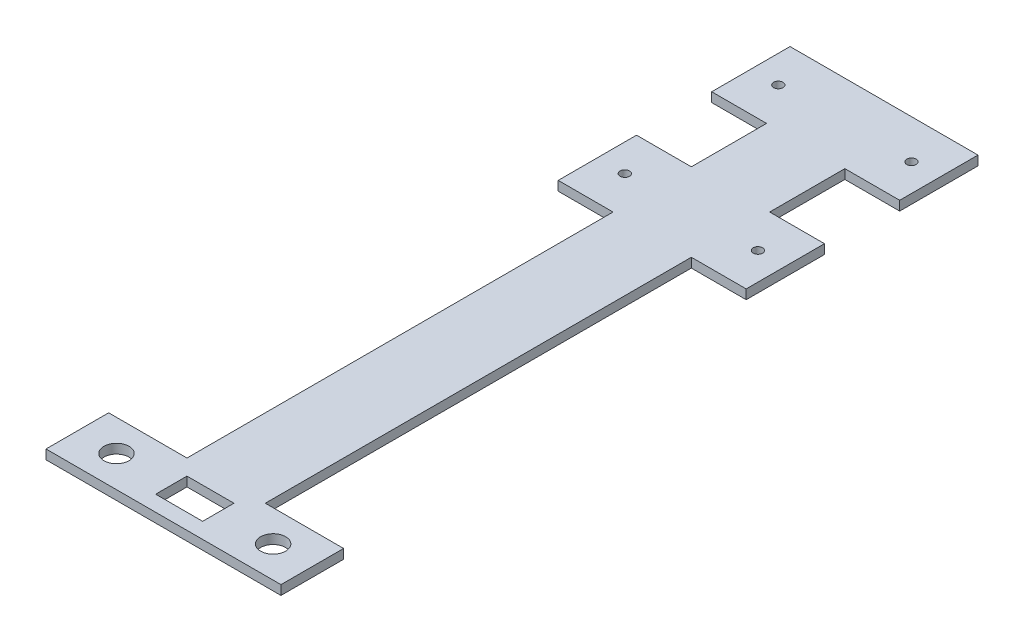
ISO-10303-21;
HEADER;
FILE_DESCRIPTION(('STEP AP214'),'2;1');
FILE_NAME('part.step','',(''),(''),'','','');
FILE_SCHEMA(('AUTOMOTIVE_DESIGN { 1 0 10303 214 1 1 1 1 }'));
ENDSEC;
DATA;
#1=APPLICATION_CONTEXT('core data for automotive mechanical design processes');
#2=APPLICATION_PROTOCOL_DEFINITION('international standard','automotive_design',2000,#1);
#3=PRODUCT_CONTEXT('',#1,'mechanical');
#4=PRODUCT('Part','Part','',(#3));
#5=PRODUCT_RELATED_PRODUCT_CATEGORY('part','',(#4));
#6=PRODUCT_DEFINITION_FORMATION('','',#4);
#7=PRODUCT_DEFINITION_CONTEXT('part definition',#1,'design');
#8=PRODUCT_DEFINITION('design','',#6,#7);
#9=PRODUCT_DEFINITION_SHAPE('','',#8);
#10=(LENGTH_UNIT() NAMED_UNIT(*) SI_UNIT(.MILLI.,.METRE.));
#11=(NAMED_UNIT(*) PLANE_ANGLE_UNIT() SI_UNIT($,.RADIAN.));
#12=(NAMED_UNIT(*) SI_UNIT($,.STERADIAN.) SOLID_ANGLE_UNIT());
#13=UNCERTAINTY_MEASURE_WITH_UNIT(LENGTH_MEASURE(1.E-05),#10,'distance_accuracy_value','');
#14=(GEOMETRIC_REPRESENTATION_CONTEXT(3) GLOBAL_UNCERTAINTY_ASSIGNED_CONTEXT((#13)) GLOBAL_UNIT_ASSIGNED_CONTEXT((#10,
#11,#12)) REPRESENTATION_CONTEXT('',''));
#15=CARTESIAN_POINT('',(0.,0.,0.));
#16=DIRECTION('',(0.,0.,1.));
#17=DIRECTION('',(1.,0.,0.));
#18=AXIS2_PLACEMENT_3D('',#15,#16,#17);
#19=CARTESIAN_POINT('',(0.,3.,-41.));
#20=DIRECTION('',(0.,0.,1.));
#21=DIRECTION('',(1.,0.,0.));
#22=AXIS2_PLACEMENT_3D('',#19,#20,#21);
#23=PLANE('',#22);
#24=DIRECTION('',(-1.,0.,0.));
#25=VECTOR('',#24,1.);
#26=CARTESIAN_POINT('',(0.,0.,-41.));
#27=LINE('',#26,#25);
#28=CARTESIAN_POINT('',(30.,0.,-41.));
#29=VERTEX_POINT('',#28);
#30=CARTESIAN_POINT('',(12.5,0.,-41.));
#31=VERTEX_POINT('',#30);
#32=EDGE_CURVE('E295',#29,#31,#27,.T.);
#33=ORIENTED_EDGE('',*,*,#32,.F.);
#34=DIRECTION('',(0.,-1.,0.));
#35=VECTOR('',#34,1.);
#36=CARTESIAN_POINT('',(30.,3.,-41.));
#37=LINE('',#36,#35);
#38=CARTESIAN_POINT('',(30.,3.,-41.));
#39=VERTEX_POINT('',#38);
#40=EDGE_CURVE('E11',#39,#29,#37,.T.);
#41=ORIENTED_EDGE('',*,*,#40,.F.);
#42=DIRECTION('',(-1.,0.,0.));
#43=VECTOR('',#42,1.);
#44=CARTESIAN_POINT('',(0.,3.,-41.));
#45=LINE('',#44,#43);
#46=CARTESIAN_POINT('',(12.5,3.,-41.));
#47=VERTEX_POINT('',#46);
#48=EDGE_CURVE('E296',#39,#47,#45,.T.);
#49=ORIENTED_EDGE('',*,*,#48,.T.);
#50=DIRECTION('',(0.,-1.,0.));
#51=VECTOR('',#50,1.);
#52=CARTESIAN_POINT('',(12.5,3.,-41.));
#53=LINE('',#52,#51);
#54=EDGE_CURVE('E427',#47,#31,#53,.T.);
#55=ORIENTED_EDGE('',*,*,#54,.T.);
#56=EDGE_LOOP('',(#33,#41,#49,#55));
#57=FACE_BOUND('',#56,.T.);
#58=ADVANCED_FACE('F41',(#57),#23,.T.);
#59=CARTESIAN_POINT('',(30.,3.,0.));
#60=DIRECTION('',(1.,0.,0.));
#61=DIRECTION('',(0.,0.,-1.));
#62=AXIS2_PLACEMENT_3D('',#59,#60,#61);
#63=PLANE('',#62);
#64=DIRECTION('',(0.,0.,1.));
#65=VECTOR('',#64,1.);
#66=CARTESIAN_POINT('',(30.,0.,0.));
#67=LINE('',#66,#65);
#68=CARTESIAN_POINT('',(30.,0.,-66.));
#69=VERTEX_POINT('',#68);
#70=EDGE_CURVE('E365',#69,#29,#67,.T.);
#71=ORIENTED_EDGE('',*,*,#70,.F.);
#72=DIRECTION('',(0.,-1.,0.));
#73=VECTOR('',#72,1.);
#74=CARTESIAN_POINT('',(30.,3.,-66.));
#75=LINE('',#74,#73);
#76=CARTESIAN_POINT('',(30.,3.,-66.));
#77=VERTEX_POINT('',#76);
#78=EDGE_CURVE('E49',#77,#69,#75,.T.);
#79=ORIENTED_EDGE('',*,*,#78,.F.);
#80=DIRECTION('',(0.,0.,1.));
#81=VECTOR('',#80,1.);
#82=CARTESIAN_POINT('',(30.,3.,0.));
#83=LINE('',#82,#81);
#84=EDGE_CURVE('E300',#77,#39,#83,.T.);
#85=ORIENTED_EDGE('',*,*,#84,.T.);
#86=ORIENTED_EDGE('',*,*,#40,.T.);
#87=EDGE_LOOP('',(#71,#79,#85,#86));
#88=FACE_BOUND('',#87,.T.);
#89=ADVANCED_FACE('F495',(#88),#63,.T.);
#90=CARTESIAN_POINT('',(0.,3.,-66.));
#91=DIRECTION('',(0.,0.,-1.));
#92=DIRECTION('',(-1.,0.,0.));
#93=AXIS2_PLACEMENT_3D('',#90,#91,#92);
#94=PLANE('',#93);
#95=DIRECTION('',(1.,0.,0.));
#96=VECTOR('',#95,1.);
#97=CARTESIAN_POINT('',(0.,0.,-66.));
#98=LINE('',#97,#96);
#99=CARTESIAN_POINT('',(12.5,0.,-66.));
#100=VERTEX_POINT('',#99);
#101=EDGE_CURVE('E369',#100,#69,#98,.T.);
#102=ORIENTED_EDGE('',*,*,#101,.F.);
#103=DIRECTION('',(0.,-1.,0.));
#104=VECTOR('',#103,1.);
#105=CARTESIAN_POINT('',(12.5,3.,-66.));
#106=LINE('',#105,#104);
#107=CARTESIAN_POINT('',(12.5,3.,-66.));
#108=VERTEX_POINT('',#107);
#109=EDGE_CURVE('E485',#108,#100,#106,.T.);
#110=ORIENTED_EDGE('',*,*,#109,.F.);
#111=DIRECTION('',(1.,0.,0.));
#112=VECTOR('',#111,1.);
#113=CARTESIAN_POINT('',(0.,3.,-66.));
#114=LINE('',#113,#112);
#115=EDGE_CURVE('E305',#108,#77,#114,.T.);
#116=ORIENTED_EDGE('',*,*,#115,.T.);
#117=ORIENTED_EDGE('',*,*,#78,.T.);
#118=EDGE_LOOP('',(#102,#110,#116,#117));
#119=FACE_BOUND('',#118,.T.);
#120=ADVANCED_FACE('F491',(#119),#94,.T.);
#121=CARTESIAN_POINT('',(12.5,3.,0.));
#122=DIRECTION('',(-1.,0.,0.));
#123=DIRECTION('',(0.,0.,1.));
#124=AXIS2_PLACEMENT_3D('',#121,#122,#123);
#125=PLANE('',#124);
#126=DIRECTION('',(0.,0.,-1.));
#127=VECTOR('',#126,1.);
#128=CARTESIAN_POINT('',(12.5,0.,0.));
#129=LINE('',#128,#127);
#130=CARTESIAN_POINT('',(12.5,0.,-90.));
#131=VERTEX_POINT('',#130);
#132=EDGE_CURVE('E373',#100,#131,#129,.T.);
#133=ORIENTED_EDGE('',*,*,#132,.T.);
#134=DIRECTION('',(0.,-1.,0.));
#135=VECTOR('',#134,1.);
#136=CARTESIAN_POINT('',(12.5,3.,-90.));
#137=LINE('',#136,#135);
#138=CARTESIAN_POINT('',(12.5,3.,-90.));
#139=VERTEX_POINT('',#138);
#140=EDGE_CURVE('E481',#139,#131,#137,.T.);
#141=ORIENTED_EDGE('',*,*,#140,.F.);
#142=DIRECTION('',(0.,0.,-1.));
#143=VECTOR('',#142,1.);
#144=CARTESIAN_POINT('',(12.5,3.,0.));
#145=LINE('',#144,#143);
#146=EDGE_CURVE('E309',#108,#139,#145,.T.);
#147=ORIENTED_EDGE('',*,*,#146,.F.);
#148=ORIENTED_EDGE('',*,*,#109,.T.);
#149=EDGE_LOOP('',(#133,#141,#147,#148));
#150=FACE_BOUND('',#149,.T.);
#151=ADVANCED_FACE('F503',(#150),#125,.F.);
#152=CARTESIAN_POINT('',(0.,3.,-90.));
#153=DIRECTION('',(0.,0.,-1.));
#154=DIRECTION('',(-1.,0.,0.));
#155=AXIS2_PLACEMENT_3D('',#152,#153,#154);
#156=PLANE('',#155);
#157=DIRECTION('',(1.,0.,0.));
#158=VECTOR('',#157,1.);
#159=CARTESIAN_POINT('',(0.,0.,-90.));
#160=LINE('',#159,#158);
#161=CARTESIAN_POINT('',(30.,0.,-90.));
#162=VERTEX_POINT('',#161);
#163=EDGE_CURVE('E376',#131,#162,#160,.T.);
#164=ORIENTED_EDGE('',*,*,#163,.T.);
#165=DIRECTION('',(0.,-1.,0.));
#166=VECTOR('',#165,1.);
#167=CARTESIAN_POINT('',(30.,3.,-90.));
#168=LINE('',#167,#166);
#169=CARTESIAN_POINT('',(30.,3.,-90.));
#170=VERTEX_POINT('',#169);
#171=EDGE_CURVE('E477',#170,#162,#168,.T.);
#172=ORIENTED_EDGE('',*,*,#171,.F.);
#173=DIRECTION('',(1.,0.,0.));
#174=VECTOR('',#173,1.);
#175=CARTESIAN_POINT('',(0.,3.,-90.));
#176=LINE('',#175,#174);
#177=EDGE_CURVE('E312',#139,#170,#176,.T.);
#178=ORIENTED_EDGE('',*,*,#177,.F.);
#179=ORIENTED_EDGE('',*,*,#140,.T.);
#180=EDGE_LOOP('',(#164,#172,#178,#179));
#181=FACE_BOUND('',#180,.T.);
#182=ADVANCED_FACE('F507',(#181),#156,.F.);
#183=CARTESIAN_POINT('',(30.,3.,0.));
#184=DIRECTION('',(-1.,0.,0.));
#185=DIRECTION('',(0.,0.,1.));
#186=AXIS2_PLACEMENT_3D('',#183,#184,#185);
#187=PLANE('',#186);
#188=DIRECTION('',(0.,0.,-1.));
#189=VECTOR('',#188,1.);
#190=CARTESIAN_POINT('',(30.,0.,0.));
#191=LINE('',#190,#189);
#192=CARTESIAN_POINT('',(30.,0.,-115.));
#193=VERTEX_POINT('',#192);
#194=EDGE_CURVE('E379',#162,#193,#191,.T.);
#195=ORIENTED_EDGE('',*,*,#194,.T.);
#196=DIRECTION('',(0.,-1.,0.));
#197=VECTOR('',#196,1.);
#198=CARTESIAN_POINT('',(30.,3.,-115.));
#199=LINE('',#198,#197);
#200=CARTESIAN_POINT('',(30.,3.,-115.));
#201=VERTEX_POINT('',#200);
#202=EDGE_CURVE('E474',#201,#193,#199,.T.);
#203=ORIENTED_EDGE('',*,*,#202,.F.);
#204=DIRECTION('',(0.,0.,-1.));
#205=VECTOR('',#204,1.);
#206=CARTESIAN_POINT('',(30.,3.,0.));
#207=LINE('',#206,#205);
#208=EDGE_CURVE('E316',#170,#201,#207,.T.);
#209=ORIENTED_EDGE('',*,*,#208,.F.);
#210=ORIENTED_EDGE('',*,*,#171,.T.);
#211=EDGE_LOOP('',(#195,#203,#209,#210));
#212=FACE_BOUND('',#211,.T.);
#213=ADVANCED_FACE('F562',(#212),#187,.F.);
#214=CARTESIAN_POINT('',(0.,3.,-115.));
#215=DIRECTION('',(0.,0.,-1.));
#216=DIRECTION('',(-1.,0.,0.));
#217=AXIS2_PLACEMENT_3D('',#214,#215,#216);
#218=PLANE('',#217);
#219=DIRECTION('',(1.,0.,0.));
#220=VECTOR('',#219,1.);
#221=CARTESIAN_POINT('',(0.,0.,-115.));
#222=LINE('',#221,#220);
#223=CARTESIAN_POINT('',(-30.,0.,-115.));
#224=VERTEX_POINT('',#223);
#225=EDGE_CURVE('E383',#224,#193,#222,.T.);
#226=ORIENTED_EDGE('',*,*,#225,.F.);
#227=DIRECTION('',(0.,-1.,0.));
#228=VECTOR('',#227,1.);
#229=CARTESIAN_POINT('',(-30.,3.,-115.));
#230=LINE('',#229,#228);
#231=CARTESIAN_POINT('',(-30.,3.,-115.));
#232=VERTEX_POINT('',#231);
#233=EDGE_CURVE('E471',#232,#224,#230,.T.);
#234=ORIENTED_EDGE('',*,*,#233,.F.);
#235=DIRECTION('',(1.,0.,0.));
#236=VECTOR('',#235,1.);
#237=CARTESIAN_POINT('',(0.,3.,-115.));
#238=LINE('',#237,#236);
#239=EDGE_CURVE('E319',#232,#201,#238,.T.);
#240=ORIENTED_EDGE('',*,*,#239,.T.);
#241=ORIENTED_EDGE('',*,*,#202,.T.);
#242=EDGE_LOOP('',(#226,#234,#240,#241));
#243=FACE_BOUND('',#242,.T.);
#244=ADVANCED_FACE('F560',(#243),#218,.T.);
#245=CARTESIAN_POINT('',(-30.,3.,0.));
#246=DIRECTION('',(-1.,0.,0.));
#247=DIRECTION('',(0.,0.,1.));
#248=AXIS2_PLACEMENT_3D('',#245,#246,#247);
#249=PLANE('',#248);
#250=DIRECTION('',(0.,0.,-1.));
#251=VECTOR('',#250,1.);
#252=CARTESIAN_POINT('',(-30.,0.,0.));
#253=LINE('',#252,#251);
#254=CARTESIAN_POINT('',(-30.,0.,-90.));
#255=VERTEX_POINT('',#254);
#256=EDGE_CURVE('E387',#255,#224,#253,.T.);
#257=ORIENTED_EDGE('',*,*,#256,.F.);
#258=DIRECTION('',(0.,-1.,0.));
#259=VECTOR('',#258,1.);
#260=CARTESIAN_POINT('',(-30.,3.,-90.));
#261=LINE('',#260,#259);
#262=CARTESIAN_POINT('',(-30.,3.,-90.));
#263=VERTEX_POINT('',#262);
#264=EDGE_CURVE('E468',#263,#255,#261,.T.);
#265=ORIENTED_EDGE('',*,*,#264,.F.);
#266=DIRECTION('',(0.,0.,-1.));
#267=VECTOR('',#266,1.);
#268=CARTESIAN_POINT('',(-30.,3.,0.));
#269=LINE('',#268,#267);
#270=EDGE_CURVE('E323',#263,#232,#269,.T.);
#271=ORIENTED_EDGE('',*,*,#270,.T.);
#272=ORIENTED_EDGE('',*,*,#233,.T.);
#273=EDGE_LOOP('',(#257,#265,#271,#272));
#274=FACE_BOUND('',#273,.T.);
#275=ADVANCED_FACE('F557',(#274),#249,.T.);
#276=CARTESIAN_POINT('',(0.,3.,-90.));
#277=DIRECTION('',(0.,0.,1.));
#278=DIRECTION('',(1.,0.,0.));
#279=AXIS2_PLACEMENT_3D('',#276,#277,#278);
#280=PLANE('',#279);
#281=DIRECTION('',(-1.,0.,0.));
#282=VECTOR('',#281,1.);
#283=CARTESIAN_POINT('',(0.,0.,-90.));
#284=LINE('',#283,#282);
#285=CARTESIAN_POINT('',(-12.5,0.,-90.));
#286=VERTEX_POINT('',#285);
#287=EDGE_CURVE('E391',#286,#255,#284,.T.);
#288=ORIENTED_EDGE('',*,*,#287,.F.);
#289=DIRECTION('',(0.,-1.,0.));
#290=VECTOR('',#289,1.);
#291=CARTESIAN_POINT('',(-12.5,3.,-90.));
#292=LINE('',#291,#290);
#293=CARTESIAN_POINT('',(-12.5,3.,-90.));
#294=VERTEX_POINT('',#293);
#295=EDGE_CURVE('E465',#294,#286,#292,.T.);
#296=ORIENTED_EDGE('',*,*,#295,.F.);
#297=DIRECTION('',(-1.,0.,0.));
#298=VECTOR('',#297,1.);
#299=CARTESIAN_POINT('',(0.,3.,-90.));
#300=LINE('',#299,#298);
#301=EDGE_CURVE('E327',#294,#263,#300,.T.);
#302=ORIENTED_EDGE('',*,*,#301,.T.);
#303=ORIENTED_EDGE('',*,*,#264,.T.);
#304=EDGE_LOOP('',(#288,#296,#302,#303));
#305=FACE_BOUND('',#304,.T.);
#306=ADVANCED_FACE('F553',(#305),#280,.T.);
#307=CARTESIAN_POINT('',(-12.5,3.,0.));
#308=DIRECTION('',(-1.,0.,0.));
#309=DIRECTION('',(0.,0.,1.));
#310=AXIS2_PLACEMENT_3D('',#307,#308,#309);
#311=PLANE('',#310);
#312=DIRECTION('',(0.,0.,-1.));
#313=VECTOR('',#312,1.);
#314=CARTESIAN_POINT('',(-12.5,0.,0.));
#315=LINE('',#314,#313);
#316=CARTESIAN_POINT('',(-12.5,0.,-66.));
#317=VERTEX_POINT('',#316);
#318=EDGE_CURVE('E395',#317,#286,#315,.T.);
#319=ORIENTED_EDGE('',*,*,#318,.F.);
#320=DIRECTION('',(0.,-1.,0.));
#321=VECTOR('',#320,1.);
#322=CARTESIAN_POINT('',(-12.5,3.,-66.));
#323=LINE('',#322,#321);
#324=CARTESIAN_POINT('',(-12.5,3.,-66.));
#325=VERTEX_POINT('',#324);
#326=EDGE_CURVE('E462',#325,#317,#323,.T.);
#327=ORIENTED_EDGE('',*,*,#326,.F.);
#328=DIRECTION('',(0.,0.,-1.));
#329=VECTOR('',#328,1.);
#330=CARTESIAN_POINT('',(-12.5,3.,0.));
#331=LINE('',#330,#329);
#332=EDGE_CURVE('E331',#325,#294,#331,.T.);
#333=ORIENTED_EDGE('',*,*,#332,.T.);
#334=ORIENTED_EDGE('',*,*,#295,.T.);
#335=EDGE_LOOP('',(#319,#327,#333,#334));
#336=FACE_BOUND('',#335,.T.);
#337=ADVANCED_FACE('F547',(#336),#311,.T.);
#338=CARTESIAN_POINT('',(0.,3.,-66.));
#339=DIRECTION('',(0.,0.,1.));
#340=DIRECTION('',(1.,0.,0.));
#341=AXIS2_PLACEMENT_3D('',#338,#339,#340);
#342=PLANE('',#341);
#343=DIRECTION('',(-1.,0.,0.));
#344=VECTOR('',#343,1.);
#345=CARTESIAN_POINT('',(0.,0.,-66.));
#346=LINE('',#345,#344);
#347=CARTESIAN_POINT('',(-30.,0.,-66.));
#348=VERTEX_POINT('',#347);
#349=EDGE_CURVE('E399',#317,#348,#346,.T.);
#350=ORIENTED_EDGE('',*,*,#349,.T.);
#351=DIRECTION('',(0.,-1.,0.));
#352=VECTOR('',#351,1.);
#353=CARTESIAN_POINT('',(-30.,3.,-66.));
#354=LINE('',#353,#352);
#355=CARTESIAN_POINT('',(-30.,3.,-66.));
#356=VERTEX_POINT('',#355);
#357=EDGE_CURVE('E458',#356,#348,#354,.T.);
#358=ORIENTED_EDGE('',*,*,#357,.F.);
#359=DIRECTION('',(-1.,0.,0.));
#360=VECTOR('',#359,1.);
#361=CARTESIAN_POINT('',(0.,3.,-66.));
#362=LINE('',#361,#360);
#363=EDGE_CURVE('E335',#325,#356,#362,.T.);
#364=ORIENTED_EDGE('',*,*,#363,.F.);
#365=ORIENTED_EDGE('',*,*,#326,.T.);
#366=EDGE_LOOP('',(#350,#358,#364,#365));
#367=FACE_BOUND('',#366,.T.);
#368=ADVANCED_FACE('F622',(#367),#342,.F.);
#369=CARTESIAN_POINT('',(-30.,3.,0.));
#370=DIRECTION('',(1.,0.,0.));
#371=DIRECTION('',(0.,0.,-1.));
#372=AXIS2_PLACEMENT_3D('',#369,#370,#371);
#373=PLANE('',#372);
#374=DIRECTION('',(0.,0.,1.));
#375=VECTOR('',#374,1.);
#376=CARTESIAN_POINT('',(-30.,0.,0.));
#377=LINE('',#376,#375);
#378=CARTESIAN_POINT('',(-30.,0.,-41.));
#379=VERTEX_POINT('',#378);
#380=EDGE_CURVE('E403',#348,#379,#377,.T.);
#381=ORIENTED_EDGE('',*,*,#380,.T.);
#382=DIRECTION('',(0.,-1.,0.));
#383=VECTOR('',#382,1.);
#384=CARTESIAN_POINT('',(-30.,3.,-41.));
#385=LINE('',#384,#383);
#386=CARTESIAN_POINT('',(-30.,3.,-41.));
#387=VERTEX_POINT('',#386);
#388=EDGE_CURVE('E454',#387,#379,#385,.T.);
#389=ORIENTED_EDGE('',*,*,#388,.F.);
#390=DIRECTION('',(0.,0.,1.));
#391=VECTOR('',#390,1.);
#392=CARTESIAN_POINT('',(-30.,3.,0.));
#393=LINE('',#392,#391);
#394=EDGE_CURVE('E339',#356,#387,#393,.T.);
#395=ORIENTED_EDGE('',*,*,#394,.F.);
#396=ORIENTED_EDGE('',*,*,#357,.T.);
#397=EDGE_LOOP('',(#381,#389,#395,#396));
#398=FACE_BOUND('',#397,.T.);
#399=ADVANCED_FACE('F541',(#398),#373,.F.);
#400=CARTESIAN_POINT('',(0.,3.,-41.));
#401=DIRECTION('',(0.,0.,-1.));
#402=DIRECTION('',(-1.,0.,0.));
#403=AXIS2_PLACEMENT_3D('',#400,#401,#402);
#404=PLANE('',#403);
#405=DIRECTION('',(1.,0.,0.));
#406=VECTOR('',#405,1.);
#407=CARTESIAN_POINT('',(0.,0.,-41.));
#408=LINE('',#407,#406);
#409=CARTESIAN_POINT('',(-12.5,0.,-41.));
#410=VERTEX_POINT('',#409);
#411=EDGE_CURVE('E406',#379,#410,#408,.T.);
#412=ORIENTED_EDGE('',*,*,#411,.T.);
#413=DIRECTION('',(0.,-1.,0.));
#414=VECTOR('',#413,1.);
#415=CARTESIAN_POINT('',(-12.5,3.,-41.));
#416=LINE('',#415,#414);
#417=CARTESIAN_POINT('',(-12.5,3.,-41.));
#418=VERTEX_POINT('',#417);
#419=EDGE_CURVE('E451',#418,#410,#416,.T.);
#420=ORIENTED_EDGE('',*,*,#419,.F.);
#421=DIRECTION('',(1.,0.,0.));
#422=VECTOR('',#421,1.);
#423=CARTESIAN_POINT('',(0.,3.,-41.));
#424=LINE('',#423,#422);
#425=EDGE_CURVE('E342',#387,#418,#424,.T.);
#426=ORIENTED_EDGE('',*,*,#425,.F.);
#427=ORIENTED_EDGE('',*,*,#388,.T.);
#428=EDGE_LOOP('',(#412,#420,#426,#427));
#429=FACE_BOUND('',#428,.T.);
#430=ADVANCED_FACE('F537',(#429),#404,.F.);
#431=CARTESIAN_POINT('',(-12.5,0.,95.));
#432=VERTEX_POINT('',#431);
#433=EDGE_CURVE('E400',#432,#410,#315,.T.);
#434=ORIENTED_EDGE('',*,*,#433,.F.);
#435=DIRECTION('',(0.,-1.,0.));
#436=VECTOR('',#435,1.);
#437=CARTESIAN_POINT('',(-12.5,3.,95.));
#438=LINE('',#437,#436);
#439=CARTESIAN_POINT('',(-12.5,3.,95.));
#440=VERTEX_POINT('',#439);
#441=EDGE_CURVE('E448',#440,#432,#438,.T.);
#442=ORIENTED_EDGE('',*,*,#441,.F.);
#443=EDGE_CURVE('E336',#440,#418,#331,.T.);
#444=ORIENTED_EDGE('',*,*,#443,.T.);
#445=ORIENTED_EDGE('',*,*,#419,.T.);
#446=EDGE_LOOP('',(#434,#442,#444,#445));
#447=FACE_BOUND('',#446,.T.);
#448=ADVANCED_FACE('F531',(#447),#311,.T.);
#449=CARTESIAN_POINT('',(0.,3.,95.));
#450=DIRECTION('',(0.,0.,-1.));
#451=DIRECTION('',(-1.,0.,0.));
#452=AXIS2_PLACEMENT_3D('',#449,#450,#451);
#453=PLANE('',#452);
#454=DIRECTION('',(1.,0.,0.));
#455=VECTOR('',#454,1.);
#456=CARTESIAN_POINT('',(0.,0.,95.));
#457=LINE('',#456,#455);
#458=CARTESIAN_POINT('',(-37.5,0.,95.));
#459=VERTEX_POINT('',#458);
#460=EDGE_CURVE('E410',#459,#432,#457,.T.);
#461=ORIENTED_EDGE('',*,*,#460,.F.);
#462=DIRECTION('',(0.,-1.,0.));
#463=VECTOR('',#462,1.);
#464=CARTESIAN_POINT('',(-37.5,3.,95.));
#465=LINE('',#464,#463);
#466=CARTESIAN_POINT('',(-37.5,3.,95.));
#467=VERTEX_POINT('',#466);
#468=EDGE_CURVE('E445',#467,#459,#465,.T.);
#469=ORIENTED_EDGE('',*,*,#468,.F.);
#470=DIRECTION('',(1.,0.,0.));
#471=VECTOR('',#470,1.);
#472=CARTESIAN_POINT('',(0.,3.,95.));
#473=LINE('',#472,#471);
#474=EDGE_CURVE('E345',#467,#440,#473,.T.);
#475=ORIENTED_EDGE('',*,*,#474,.T.);
#476=ORIENTED_EDGE('',*,*,#441,.T.);
#477=EDGE_LOOP('',(#461,#469,#475,#476));
#478=FACE_BOUND('',#477,.T.);
#479=ADVANCED_FACE('F611',(#478),#453,.T.);
#480=CARTESIAN_POINT('',(-37.5,3.,0.));
#481=DIRECTION('',(-1.,0.,0.));
#482=DIRECTION('',(0.,0.,1.));
#483=AXIS2_PLACEMENT_3D('',#480,#481,#482);
#484=PLANE('',#483);
#485=DIRECTION('',(0.,0.,-1.));
#486=VECTOR('',#485,1.);
#487=CARTESIAN_POINT('',(-37.5,0.,0.));
#488=LINE('',#487,#486);
#489=CARTESIAN_POINT('',(-37.5,0.,115.));
#490=VERTEX_POINT('',#489);
#491=EDGE_CURVE('E414',#490,#459,#488,.T.);
#492=ORIENTED_EDGE('',*,*,#491,.F.);
#493=DIRECTION('',(0.,-1.,0.));
#494=VECTOR('',#493,1.);
#495=CARTESIAN_POINT('',(-37.5,3.,115.));
#496=LINE('',#495,#494);
#497=CARTESIAN_POINT('',(-37.5,3.,115.));
#498=VERTEX_POINT('',#497);
#499=EDGE_CURVE('E442',#498,#490,#496,.T.);
#500=ORIENTED_EDGE('',*,*,#499,.F.);
#501=DIRECTION('',(0.,0.,-1.));
#502=VECTOR('',#501,1.);
#503=CARTESIAN_POINT('',(-37.5,3.,0.));
#504=LINE('',#503,#502);
#505=EDGE_CURVE('E349',#498,#467,#504,.T.);
#506=ORIENTED_EDGE('',*,*,#505,.T.);
#507=ORIENTED_EDGE('',*,*,#468,.T.);
#508=EDGE_LOOP('',(#492,#500,#506,#507));
#509=FACE_BOUND('',#508,.T.);
#510=ADVANCED_FACE('F607',(#509),#484,.T.);
#511=CARTESIAN_POINT('',(0.,3.,115.));
#512=DIRECTION('',(0.,0.,-1.));
#513=DIRECTION('',(-1.,0.,0.));
#514=AXIS2_PLACEMENT_3D('',#511,#512,#513);
#515=PLANE('',#514);
#516=DIRECTION('',(1.,0.,0.));
#517=VECTOR('',#516,1.);
#518=CARTESIAN_POINT('',(0.,0.,115.));
#519=LINE('',#518,#517);
#520=CARTESIAN_POINT('',(37.5,0.,115.));
#521=VERTEX_POINT('',#520);
#522=EDGE_CURVE('E418',#490,#521,#519,.T.);
#523=ORIENTED_EDGE('',*,*,#522,.T.);
#524=DIRECTION('',(0.,-1.,0.));
#525=VECTOR('',#524,1.);
#526=CARTESIAN_POINT('',(37.5,3.,115.));
#527=LINE('',#526,#525);
#528=CARTESIAN_POINT('',(37.5,3.,115.));
#529=VERTEX_POINT('',#528);
#530=EDGE_CURVE('E438',#529,#521,#527,.T.);
#531=ORIENTED_EDGE('',*,*,#530,.F.);
#532=DIRECTION('',(1.,0.,0.));
#533=VECTOR('',#532,1.);
#534=CARTESIAN_POINT('',(0.,3.,115.));
#535=LINE('',#534,#533);
#536=EDGE_CURVE('E353',#498,#529,#535,.T.);
#537=ORIENTED_EDGE('',*,*,#536,.F.);
#538=ORIENTED_EDGE('',*,*,#499,.T.);
#539=EDGE_LOOP('',(#523,#531,#537,#538));
#540=FACE_BOUND('',#539,.T.);
#541=ADVANCED_FACE('F601',(#540),#515,.F.);
#542=CARTESIAN_POINT('',(37.5,3.,0.));
#543=DIRECTION('',(-1.,0.,0.));
#544=DIRECTION('',(0.,0.,1.));
#545=AXIS2_PLACEMENT_3D('',#542,#543,#544);
#546=PLANE('',#545);
#547=DIRECTION('',(0.,0.,-1.));
#548=VECTOR('',#547,1.);
#549=CARTESIAN_POINT('',(37.5,0.,0.));
#550=LINE('',#549,#548);
#551=CARTESIAN_POINT('',(37.5,0.,95.));
#552=VERTEX_POINT('',#551);
#553=EDGE_CURVE('E421',#521,#552,#550,.T.);
#554=ORIENTED_EDGE('',*,*,#553,.T.);
#555=DIRECTION('',(0.,-1.,0.));
#556=VECTOR('',#555,1.);
#557=CARTESIAN_POINT('',(37.5,3.,95.));
#558=LINE('',#557,#556);
#559=CARTESIAN_POINT('',(37.5,3.,95.));
#560=VERTEX_POINT('',#559);
#561=EDGE_CURVE('E434',#560,#552,#558,.T.);
#562=ORIENTED_EDGE('',*,*,#561,.F.);
#563=DIRECTION('',(0.,0.,-1.));
#564=VECTOR('',#563,1.);
#565=CARTESIAN_POINT('',(37.5,3.,0.));
#566=LINE('',#565,#564);
#567=EDGE_CURVE('E356',#529,#560,#566,.T.);
#568=ORIENTED_EDGE('',*,*,#567,.F.);
#569=ORIENTED_EDGE('',*,*,#530,.T.);
#570=EDGE_LOOP('',(#554,#562,#568,#569));
#571=FACE_BOUND('',#570,.T.);
#572=ADVANCED_FACE('F596',(#571),#546,.F.);
#573=CARTESIAN_POINT('',(0.,3.,95.));
#574=DIRECTION('',(0.,0.,1.));
#575=DIRECTION('',(1.,0.,0.));
#576=AXIS2_PLACEMENT_3D('',#573,#574,#575);
#577=PLANE('',#576);
#578=DIRECTION('',(-1.,0.,0.));
#579=VECTOR('',#578,1.);
#580=CARTESIAN_POINT('',(0.,0.,95.));
#581=LINE('',#580,#579);
#582=CARTESIAN_POINT('',(12.5,0.,95.));
#583=VERTEX_POINT('',#582);
#584=EDGE_CURVE('E424',#552,#583,#581,.T.);
#585=ORIENTED_EDGE('',*,*,#584,.T.);
#586=DIRECTION('',(0.,-1.,0.));
#587=VECTOR('',#586,1.);
#588=CARTESIAN_POINT('',(12.5,3.,95.));
#589=LINE('',#588,#587);
#590=CARTESIAN_POINT('',(12.5,3.,95.));
#591=VERTEX_POINT('',#590);
#592=EDGE_CURVE('E430',#591,#583,#589,.T.);
#593=ORIENTED_EDGE('',*,*,#592,.F.);
#594=DIRECTION('',(-1.,0.,0.));
#595=VECTOR('',#594,1.);
#596=CARTESIAN_POINT('',(0.,3.,95.));
#597=LINE('',#596,#595);
#598=EDGE_CURVE('E359',#560,#591,#597,.T.);
#599=ORIENTED_EDGE('',*,*,#598,.F.);
#600=ORIENTED_EDGE('',*,*,#561,.T.);
#601=EDGE_LOOP('',(#585,#593,#599,#600));
#602=FACE_BOUND('',#601,.T.);
#603=ADVANCED_FACE('F589',(#602),#577,.F.);
#604=EDGE_CURVE('E301',#583,#31,#129,.T.);
#605=ORIENTED_EDGE('',*,*,#604,.T.);
#606=ORIENTED_EDGE('',*,*,#54,.F.);
#607=EDGE_CURVE('E313',#591,#47,#145,.T.);
#608=ORIENTED_EDGE('',*,*,#607,.F.);
#609=ORIENTED_EDGE('',*,*,#592,.T.);
#610=EDGE_LOOP('',(#605,#606,#608,#609));
#611=FACE_BOUND('',#610,.T.);
#612=ADVANCED_FACE('F583',(#611),#125,.F.);
#613=CARTESIAN_POINT('',(0.,3.,0.));
#614=DIRECTION('',(0.,1.,0.));
#615=DIRECTION('',(0.,0.,1.));
#616=AXIS2_PLACEMENT_3D('',#613,#614,#615);
#617=PLANE('',#616);
#618=CARTESIAN_POINT('',(25.,3.,105.));
#619=DIRECTION('',(0.,1.,0.));
#620=DIRECTION('',(0.,0.,1.));
#621=AXIS2_PLACEMENT_3D('',#618,#619,#620);
#622=CIRCLE('',#621,4.);
#623=CARTESIAN_POINT('',(25.,3.,109.));
#624=VERTEX_POINT('',#623);
#625=EDGE_CURVE('E259',#624,#624,#622,.T.);
#626=ORIENTED_EDGE('',*,*,#625,.F.);
#627=EDGE_LOOP('',(#626));
#628=FACE_BOUND('',#627,.T.);
#629=CARTESIAN_POINT('',(-25.,3.,105.));
#630=DIRECTION('',(0.,1.,0.));
#631=DIRECTION('',(0.,0.,1.));
#632=AXIS2_PLACEMENT_3D('',#629,#630,#631);
#633=CIRCLE('',#632,4.);
#634=CARTESIAN_POINT('',(-25.,3.,109.));
#635=VERTEX_POINT('',#634);
#636=EDGE_CURVE('E255',#635,#635,#633,.T.);
#637=ORIENTED_EDGE('',*,*,#636,.F.);
#638=EDGE_LOOP('',(#637));
#639=FACE_BOUND('',#638,.T.);
#640=DIRECTION('',(0.,0.,-1.));
#641=VECTOR('',#640,1.);
#642=CARTESIAN_POINT('',(7.5,3.,0.));
#643=LINE('',#642,#641);
#644=CARTESIAN_POINT('',(7.5,3.,110.));
#645=VERTEX_POINT('',#644);
#646=CARTESIAN_POINT('',(7.5,3.,100.));
#647=VERTEX_POINT('',#646);
#648=EDGE_CURVE('E207',#645,#647,#643,.T.);
#649=ORIENTED_EDGE('',*,*,#648,.F.);
#650=DIRECTION('',(1.,0.,0.));
#651=VECTOR('',#650,1.);
#652=CARTESIAN_POINT('',(0.,3.,110.));
#653=LINE('',#652,#651);
#654=CARTESIAN_POINT('',(-7.5,3.,110.));
#655=VERTEX_POINT('',#654);
#656=EDGE_CURVE('E250',#655,#645,#653,.T.);
#657=ORIENTED_EDGE('',*,*,#656,.F.);
#658=DIRECTION('',(0.,0.,1.));
#659=VECTOR('',#658,1.);
#660=CARTESIAN_POINT('',(-7.5,3.,0.));
#661=LINE('',#660,#659);
#662=CARTESIAN_POINT('',(-7.5,3.,100.));
#663=VERTEX_POINT('',#662);
#664=EDGE_CURVE('E247',#663,#655,#661,.T.);
#665=ORIENTED_EDGE('',*,*,#664,.F.);
#666=DIRECTION('',(-1.,0.,0.));
#667=VECTOR('',#666,1.);
#668=CARTESIAN_POINT('',(0.,3.,100.));
#669=LINE('',#668,#667);
#670=EDGE_CURVE('E238',#647,#663,#669,.T.);
#671=ORIENTED_EDGE('',*,*,#670,.F.);
#672=EDGE_LOOP('',(#649,#657,#665,#671));
#673=FACE_BOUND('',#672,.T.);
#674=CARTESIAN_POINT('',(-21.25,3.,-53.5));
#675=DIRECTION('',(0.,1.,0.));
#676=DIRECTION('',(0.,0.,1.));
#677=AXIS2_PLACEMENT_3D('',#674,#675,#676);
#678=CIRCLE('',#677,1.5);
#679=CARTESIAN_POINT('',(-21.25,3.,-52.));
#680=VERTEX_POINT('',#679);
#681=EDGE_CURVE('E291',#680,#680,#678,.T.);
#682=ORIENTED_EDGE('',*,*,#681,.F.);
#683=EDGE_LOOP('',(#682));
#684=FACE_BOUND('',#683,.T.);
#685=CARTESIAN_POINT('',(21.25,3.,-102.5));
#686=DIRECTION('',(0.,1.,0.));
#687=DIRECTION('',(0.,0.,1.));
#688=AXIS2_PLACEMENT_3D('',#685,#686,#687);
#689=CIRCLE('',#688,1.5);
#690=CARTESIAN_POINT('',(21.25,3.,-101.));
#691=VERTEX_POINT('',#690);
#692=EDGE_CURVE('E287',#691,#691,#689,.T.);
#693=ORIENTED_EDGE('',*,*,#692,.F.);
#694=EDGE_LOOP('',(#693));
#695=FACE_BOUND('',#694,.T.);
#696=CARTESIAN_POINT('',(-21.25,3.,-102.5));
#697=DIRECTION('',(0.,1.,0.));
#698=DIRECTION('',(0.,0.,1.));
#699=AXIS2_PLACEMENT_3D('',#696,#697,#698);
#700=CIRCLE('',#699,1.5);
#701=CARTESIAN_POINT('',(-21.25,3.,-101.));
#702=VERTEX_POINT('',#701);
#703=EDGE_CURVE('E283',#702,#702,#700,.T.);
#704=ORIENTED_EDGE('',*,*,#703,.F.);
#705=EDGE_LOOP('',(#704));
#706=FACE_BOUND('',#705,.T.);
#707=CARTESIAN_POINT('',(21.25,3.,-53.5));
#708=DIRECTION('',(0.,1.,0.));
#709=DIRECTION('',(0.,0.,1.));
#710=AXIS2_PLACEMENT_3D('',#707,#708,#709);
#711=CIRCLE('',#710,1.5);
#712=CARTESIAN_POINT('',(21.25,3.,-52.));
#713=VERTEX_POINT('',#712);
#714=EDGE_CURVE('E279',#713,#713,#711,.T.);
#715=ORIENTED_EDGE('',*,*,#714,.F.);
#716=EDGE_LOOP('',(#715));
#717=FACE_BOUND('',#716,.T.);
#718=ORIENTED_EDGE('',*,*,#48,.F.);
#719=ORIENTED_EDGE('',*,*,#84,.F.);
#720=ORIENTED_EDGE('',*,*,#115,.F.);
#721=ORIENTED_EDGE('',*,*,#146,.T.);
#722=ORIENTED_EDGE('',*,*,#177,.T.);
#723=ORIENTED_EDGE('',*,*,#208,.T.);
#724=ORIENTED_EDGE('',*,*,#239,.F.);
#725=ORIENTED_EDGE('',*,*,#270,.F.);
#726=ORIENTED_EDGE('',*,*,#301,.F.);
#727=ORIENTED_EDGE('',*,*,#332,.F.);
#728=ORIENTED_EDGE('',*,*,#363,.T.);
#729=ORIENTED_EDGE('',*,*,#394,.T.);
#730=ORIENTED_EDGE('',*,*,#425,.T.);
#731=ORIENTED_EDGE('',*,*,#443,.F.);
#732=ORIENTED_EDGE('',*,*,#474,.F.);
#733=ORIENTED_EDGE('',*,*,#505,.F.);
#734=ORIENTED_EDGE('',*,*,#536,.T.);
#735=ORIENTED_EDGE('',*,*,#567,.T.);
#736=ORIENTED_EDGE('',*,*,#598,.T.);
#737=ORIENTED_EDGE('',*,*,#607,.T.);
#738=EDGE_LOOP('',(#718,#719,#720,#721,#722,#723,#724,#725,#726,#727,#728,#729,#730,#731,#732,
#733,#734,#735,#736,#737));
#739=FACE_BOUND('',#738,.T.);
#740=ADVANCED_FACE('F512',(#628,#639,#673,#684,#695,#706,#717,#739),#617,.T.);
#741=CARTESIAN_POINT('',(0.,0.,0.));
#742=DIRECTION('',(0.,1.,0.));
#743=DIRECTION('',(0.,0.,1.));
#744=AXIS2_PLACEMENT_3D('',#741,#742,#743);
#745=PLANE('',#744);
#746=CARTESIAN_POINT('',(25.,0.,105.));
#747=DIRECTION('',(0.,1.,0.));
#748=DIRECTION('',(0.,0.,-1.));
#749=AXIS2_PLACEMENT_3D('',#746,#747,#748);
#750=CIRCLE('',#749,4.);
#751=CARTESIAN_POINT('',(25.,0.,101.));
#752=VERTEX_POINT('',#751);
#753=EDGE_CURVE('E227',#752,#752,#750,.T.);
#754=ORIENTED_EDGE('',*,*,#753,.T.);
#755=EDGE_LOOP('',(#754));
#756=FACE_BOUND('',#755,.T.);
#757=CARTESIAN_POINT('',(-25.,0.,105.));
#758=DIRECTION('',(0.,1.,0.));
#759=DIRECTION('',(0.,0.,1.));
#760=AXIS2_PLACEMENT_3D('',#757,#758,#759);
#761=CIRCLE('',#760,4.);
#762=CARTESIAN_POINT('',(-25.,0.,109.));
#763=VERTEX_POINT('',#762);
#764=EDGE_CURVE('E223',#763,#763,#761,.T.);
#765=ORIENTED_EDGE('',*,*,#764,.T.);
#766=EDGE_LOOP('',(#765));
#767=FACE_BOUND('',#766,.T.);
#768=DIRECTION('',(1.,0.,0.));
#769=VECTOR('',#768,1.);
#770=CARTESIAN_POINT('',(-7.5,0.,110.));
#771=LINE('',#770,#769);
#772=CARTESIAN_POINT('',(-7.5,0.,110.));
#773=VERTEX_POINT('',#772);
#774=CARTESIAN_POINT('',(7.5,0.,110.));
#775=VERTEX_POINT('',#774);
#776=EDGE_CURVE('E211',#773,#775,#771,.T.);
#777=ORIENTED_EDGE('',*,*,#776,.T.);
#778=DIRECTION('',(0.,0.,-1.));
#779=VECTOR('',#778,1.);
#780=CARTESIAN_POINT('',(7.5,0.,110.));
#781=LINE('',#780,#779);
#782=CARTESIAN_POINT('',(7.5,0.,100.));
#783=VERTEX_POINT('',#782);
#784=EDGE_CURVE('E204',#775,#783,#781,.T.);
#785=ORIENTED_EDGE('',*,*,#784,.T.);
#786=DIRECTION('',(-1.,0.,0.));
#787=VECTOR('',#786,1.);
#788=CARTESIAN_POINT('',(-7.5,0.,100.));
#789=LINE('',#788,#787);
#790=CARTESIAN_POINT('',(-7.5,0.,100.));
#791=VERTEX_POINT('',#790);
#792=EDGE_CURVE('E214',#783,#791,#789,.T.);
#793=ORIENTED_EDGE('',*,*,#792,.T.);
#794=DIRECTION('',(0.,0.,1.));
#795=VECTOR('',#794,1.);
#796=CARTESIAN_POINT('',(-7.5,0.,110.));
#797=LINE('',#796,#795);
#798=EDGE_CURVE('E64',#791,#773,#797,.T.);
#799=ORIENTED_EDGE('',*,*,#798,.T.);
#800=EDGE_LOOP('',(#777,#785,#793,#799));
#801=FACE_BOUND('',#800,.T.);
#802=CARTESIAN_POINT('',(-21.25,0.,-53.5));
#803=DIRECTION('',(0.,1.,0.));
#804=DIRECTION('',(0.,0.,-1.));
#805=AXIS2_PLACEMENT_3D('',#802,#803,#804);
#806=CIRCLE('',#805,1.5);
#807=CARTESIAN_POINT('',(-21.25,0.,-55.));
#808=VERTEX_POINT('',#807);
#809=EDGE_CURVE('E263',#808,#808,#806,.T.);
#810=ORIENTED_EDGE('',*,*,#809,.T.);
#811=EDGE_LOOP('',(#810));
#812=FACE_BOUND('',#811,.T.);
#813=CARTESIAN_POINT('',(21.25,0.,-102.5));
#814=DIRECTION('',(0.,1.,0.));
#815=DIRECTION('',(0.,0.,-1.));
#816=AXIS2_PLACEMENT_3D('',#813,#814,#815);
#817=CIRCLE('',#816,1.5);
#818=CARTESIAN_POINT('',(21.25,0.,-104.));
#819=VERTEX_POINT('',#818);
#820=EDGE_CURVE('E269',#819,#819,#817,.T.);
#821=ORIENTED_EDGE('',*,*,#820,.T.);
#822=EDGE_LOOP('',(#821));
#823=FACE_BOUND('',#822,.T.);
#824=CARTESIAN_POINT('',(-21.25,0.,-102.5));
#825=DIRECTION('',(0.,1.,0.));
#826=DIRECTION('',(0.,0.,1.));
#827=AXIS2_PLACEMENT_3D('',#824,#825,#826);
#828=CIRCLE('',#827,1.5);
#829=CARTESIAN_POINT('',(-21.25,0.,-101.));
#830=VERTEX_POINT('',#829);
#831=EDGE_CURVE('E264',#830,#830,#828,.T.);
#832=ORIENTED_EDGE('',*,*,#831,.T.);
#833=EDGE_LOOP('',(#832));
#834=FACE_BOUND('',#833,.T.);
#835=CARTESIAN_POINT('',(21.25,0.,-53.5));
#836=DIRECTION('',(0.,1.,0.));
#837=DIRECTION('',(0.,0.,1.));
#838=AXIS2_PLACEMENT_3D('',#835,#836,#837);
#839=CIRCLE('',#838,1.5);
#840=CARTESIAN_POINT('',(21.25,0.,-52.));
#841=VERTEX_POINT('',#840);
#842=EDGE_CURVE('E268',#841,#841,#839,.T.);
#843=ORIENTED_EDGE('',*,*,#842,.T.);
#844=EDGE_LOOP('',(#843));
#845=FACE_BOUND('',#844,.T.);
#846=ORIENTED_EDGE('',*,*,#32,.T.);
#847=ORIENTED_EDGE('',*,*,#604,.F.);
#848=ORIENTED_EDGE('',*,*,#584,.F.);
#849=ORIENTED_EDGE('',*,*,#553,.F.);
#850=ORIENTED_EDGE('',*,*,#522,.F.);
#851=ORIENTED_EDGE('',*,*,#491,.T.);
#852=ORIENTED_EDGE('',*,*,#460,.T.);
#853=ORIENTED_EDGE('',*,*,#433,.T.);
#854=ORIENTED_EDGE('',*,*,#411,.F.);
#855=ORIENTED_EDGE('',*,*,#380,.F.);
#856=ORIENTED_EDGE('',*,*,#349,.F.);
#857=ORIENTED_EDGE('',*,*,#318,.T.);
#858=ORIENTED_EDGE('',*,*,#287,.T.);
#859=ORIENTED_EDGE('',*,*,#256,.T.);
#860=ORIENTED_EDGE('',*,*,#225,.T.);
#861=ORIENTED_EDGE('',*,*,#194,.F.);
#862=ORIENTED_EDGE('',*,*,#163,.F.);
#863=ORIENTED_EDGE('',*,*,#132,.F.);
#864=ORIENTED_EDGE('',*,*,#101,.T.);
#865=ORIENTED_EDGE('',*,*,#70,.T.);
#866=EDGE_LOOP('',(#846,#847,#848,#849,#850,#851,#852,#853,#854,#855,#856,#857,#858,#859,#860,
#861,#862,#863,#864,#865));
#867=FACE_BOUND('',#866,.T.);
#868=ADVANCED_FACE('F219',(#756,#767,#801,#812,#823,#834,#845,#867),#745,.F.);
#869=CARTESIAN_POINT('',(21.25,0.,-53.5));
#870=DIRECTION('',(0.,1.,0.));
#871=DIRECTION('',(0.,0.,1.));
#872=AXIS2_PLACEMENT_3D('',#869,#870,#871);
#873=CYLINDRICAL_SURFACE('',#872,1.5);
#874=ORIENTED_EDGE('',*,*,#714,.T.);
#875=EDGE_LOOP('',(#874));
#876=FACE_BOUND('',#875,.T.);
#877=ORIENTED_EDGE('',*,*,#842,.F.);
#878=EDGE_LOOP('',(#877));
#879=FACE_BOUND('',#878,.T.);
#880=ADVANCED_FACE('F687',(#876,#879),#873,.F.);
#881=CARTESIAN_POINT('',(-21.25,0.,-102.5));
#882=DIRECTION('',(0.,1.,0.));
#883=DIRECTION('',(0.,0.,1.));
#884=AXIS2_PLACEMENT_3D('',#881,#882,#883);
#885=CYLINDRICAL_SURFACE('',#884,1.5);
#886=ORIENTED_EDGE('',*,*,#703,.T.);
#887=EDGE_LOOP('',(#886));
#888=FACE_BOUND('',#887,.T.);
#889=ORIENTED_EDGE('',*,*,#831,.F.);
#890=EDGE_LOOP('',(#889));
#891=FACE_BOUND('',#890,.T.);
#892=ADVANCED_FACE('F692',(#888,#891),#885,.F.);
#893=CARTESIAN_POINT('',(21.25,0.,-102.5));
#894=DIRECTION('',(0.,1.,0.));
#895=DIRECTION('',(0.,0.,1.));
#896=AXIS2_PLACEMENT_3D('',#893,#894,#895);
#897=CYLINDRICAL_SURFACE('',#896,1.5);
#898=ORIENTED_EDGE('',*,*,#692,.T.);
#899=EDGE_LOOP('',(#898));
#900=FACE_BOUND('',#899,.T.);
#901=ORIENTED_EDGE('',*,*,#820,.F.);
#902=EDGE_LOOP('',(#901));
#903=FACE_BOUND('',#902,.T.);
#904=ADVANCED_FACE('F704',(#900,#903),#897,.F.);
#905=CARTESIAN_POINT('',(-21.25,0.,-53.5));
#906=DIRECTION('',(0.,1.,0.));
#907=DIRECTION('',(0.,0.,1.));
#908=AXIS2_PLACEMENT_3D('',#905,#906,#907);
#909=CYLINDRICAL_SURFACE('',#908,1.5);
#910=ORIENTED_EDGE('',*,*,#681,.T.);
#911=EDGE_LOOP('',(#910));
#912=FACE_BOUND('',#911,.T.);
#913=ORIENTED_EDGE('',*,*,#809,.F.);
#914=EDGE_LOOP('',(#913));
#915=FACE_BOUND('',#914,.T.);
#916=ADVANCED_FACE('F714',(#912,#915),#909,.F.);
#917=CARTESIAN_POINT('',(7.5,0.,110.));
#918=DIRECTION('',(1.,0.,0.));
#919=DIRECTION('',(0.,0.,-1.));
#920=AXIS2_PLACEMENT_3D('',#917,#918,#919);
#921=PLANE('',#920);
#922=ORIENTED_EDGE('',*,*,#648,.T.);
#923=DIRECTION('',(0.,1.,0.));
#924=VECTOR('',#923,1.);
#925=CARTESIAN_POINT('',(7.5,0.,100.));
#926=LINE('',#925,#924);
#927=EDGE_CURVE('E56',#783,#647,#926,.T.);
#928=ORIENTED_EDGE('',*,*,#927,.F.);
#929=ORIENTED_EDGE('',*,*,#784,.F.);
#930=DIRECTION('',(0.,1.,0.));
#931=VECTOR('',#930,1.);
#932=CARTESIAN_POINT('',(7.5,0.,110.));
#933=LINE('',#932,#931);
#934=EDGE_CURVE('E235',#775,#645,#933,.T.);
#935=ORIENTED_EDGE('',*,*,#934,.T.);
#936=EDGE_LOOP('',(#922,#928,#929,#935));
#937=FACE_BOUND('',#936,.T.);
#938=ADVANCED_FACE('F201',(#937),#921,.F.);
#939=CARTESIAN_POINT('',(-7.5,0.,110.));
#940=DIRECTION('',(0.,0.,1.));
#941=DIRECTION('',(1.,0.,0.));
#942=AXIS2_PLACEMENT_3D('',#939,#940,#941);
#943=PLANE('',#942);
#944=ORIENTED_EDGE('',*,*,#656,.T.);
#945=ORIENTED_EDGE('',*,*,#934,.F.);
#946=ORIENTED_EDGE('',*,*,#776,.F.);
#947=DIRECTION('',(0.,1.,0.));
#948=VECTOR('',#947,1.);
#949=CARTESIAN_POINT('',(-7.5,0.,110.));
#950=LINE('',#949,#948);
#951=EDGE_CURVE('E239',#773,#655,#950,.T.);
#952=ORIENTED_EDGE('',*,*,#951,.T.);
#953=EDGE_LOOP('',(#944,#945,#946,#952));
#954=FACE_BOUND('',#953,.T.);
#955=ADVANCED_FACE('F748',(#954),#943,.F.);
#956=CARTESIAN_POINT('',(-7.5,0.,110.));
#957=DIRECTION('',(-1.,0.,0.));
#958=DIRECTION('',(0.,0.,1.));
#959=AXIS2_PLACEMENT_3D('',#956,#957,#958);
#960=PLANE('',#959);
#961=ORIENTED_EDGE('',*,*,#664,.T.);
#962=ORIENTED_EDGE('',*,*,#951,.F.);
#963=ORIENTED_EDGE('',*,*,#798,.F.);
#964=DIRECTION('',(0.,1.,0.));
#965=VECTOR('',#964,1.);
#966=CARTESIAN_POINT('',(-7.5,0.,100.));
#967=LINE('',#966,#965);
#968=EDGE_CURVE('E210',#791,#663,#967,.T.);
#969=ORIENTED_EDGE('',*,*,#968,.T.);
#970=EDGE_LOOP('',(#961,#962,#963,#969));
#971=FACE_BOUND('',#970,.T.);
#972=ADVANCED_FACE('F757',(#971),#960,.F.);
#973=CARTESIAN_POINT('',(-7.5,0.,100.));
#974=DIRECTION('',(0.,0.,-1.));
#975=DIRECTION('',(-1.,0.,0.));
#976=AXIS2_PLACEMENT_3D('',#973,#974,#975);
#977=PLANE('',#976);
#978=ORIENTED_EDGE('',*,*,#670,.T.);
#979=ORIENTED_EDGE('',*,*,#968,.F.);
#980=ORIENTED_EDGE('',*,*,#792,.F.);
#981=ORIENTED_EDGE('',*,*,#927,.T.);
#982=EDGE_LOOP('',(#978,#979,#980,#981));
#983=FACE_BOUND('',#982,.T.);
#984=ADVANCED_FACE('F215',(#983),#977,.F.);
#985=CARTESIAN_POINT('',(-25.,0.,105.));
#986=DIRECTION('',(0.,1.,0.));
#987=DIRECTION('',(0.,0.,1.));
#988=AXIS2_PLACEMENT_3D('',#985,#986,#987);
#989=CYLINDRICAL_SURFACE('',#988,4.);
#990=ORIENTED_EDGE('',*,*,#636,.T.);
#991=EDGE_LOOP('',(#990));
#992=FACE_BOUND('',#991,.T.);
#993=ORIENTED_EDGE('',*,*,#764,.F.);
#994=EDGE_LOOP('',(#993));
#995=FACE_BOUND('',#994,.T.);
#996=ADVANCED_FACE('F775',(#992,#995),#989,.F.);
#997=CARTESIAN_POINT('',(25.,0.,105.));
#998=DIRECTION('',(0.,1.,0.));
#999=DIRECTION('',(0.,0.,1.));
#1000=AXIS2_PLACEMENT_3D('',#997,#998,#999);
#1001=CYLINDRICAL_SURFACE('',#1000,4.);
#1002=ORIENTED_EDGE('',*,*,#625,.T.);
#1003=EDGE_LOOP('',(#1002));
#1004=FACE_BOUND('',#1003,.T.);
#1005=ORIENTED_EDGE('',*,*,#753,.F.);
#1006=EDGE_LOOP('',(#1005));
#1007=FACE_BOUND('',#1006,.T.);
#1008=ADVANCED_FACE('F784',(#1004,#1007),#1001,.F.);
#1009=CLOSED_SHELL('',(#58,#89,#120,#151,#182,#213,#244,#275,#306,#337,#368,#399,#430,#448,#479,
#510,#541,#572,#603,#612,#740,#868,#880,#892,#904,#916,#938,#955,#972,#984,#996,#1008));
#1010=MANIFOLD_SOLID_BREP('B2',#1009);
#1011=ADVANCED_BREP_SHAPE_REPRESENTATION('',(#18,#1010),#14);
#1012=SHAPE_DEFINITION_REPRESENTATION(#9,#1011);
ENDSEC;
END-ISO-10303-21;
